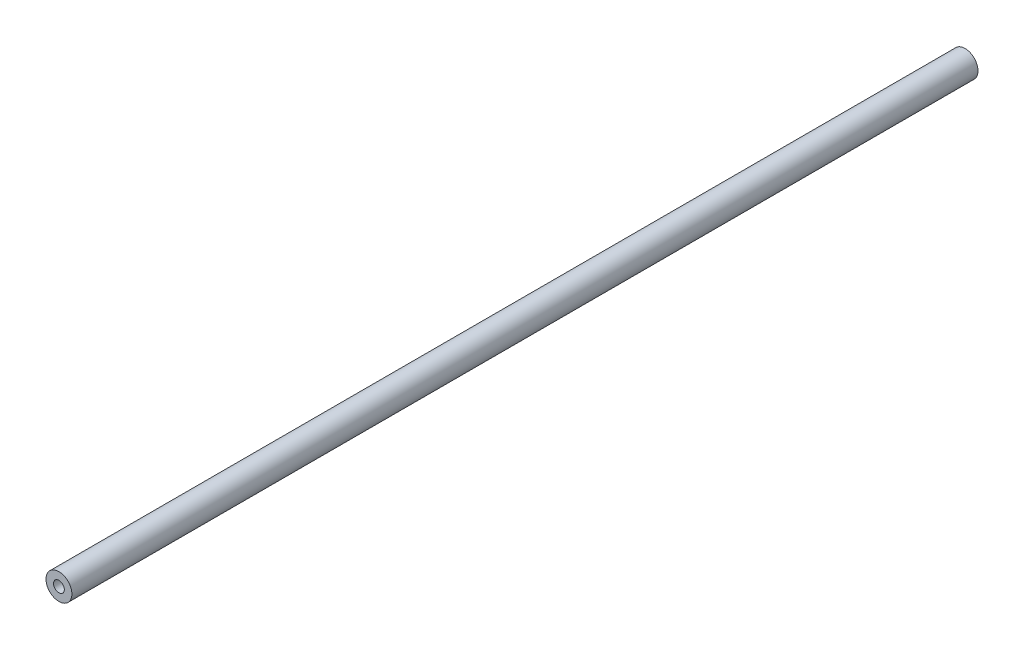
ISO-10303-21;
HEADER;
FILE_DESCRIPTION(('STEP AP214'),'2;1');
FILE_NAME('part.step','',(''),(''),'','','');
FILE_SCHEMA(('AUTOMOTIVE_DESIGN { 1 0 10303 214 1 1 1 1 }'));
ENDSEC;
DATA;
#1=APPLICATION_CONTEXT('core data for automotive mechanical design processes');
#2=APPLICATION_PROTOCOL_DEFINITION('international standard','automotive_design',2000,#1);
#3=PRODUCT_CONTEXT('',#1,'mechanical');
#4=PRODUCT('Part','Part','',(#3));
#5=PRODUCT_RELATED_PRODUCT_CATEGORY('part','',(#4));
#6=PRODUCT_DEFINITION_FORMATION('','',#4);
#7=PRODUCT_DEFINITION_CONTEXT('part definition',#1,'design');
#8=PRODUCT_DEFINITION('design','',#6,#7);
#9=PRODUCT_DEFINITION_SHAPE('','',#8);
#10=(LENGTH_UNIT() NAMED_UNIT(*) SI_UNIT(.MILLI.,.METRE.));
#11=(NAMED_UNIT(*) PLANE_ANGLE_UNIT() SI_UNIT($,.RADIAN.));
#12=(NAMED_UNIT(*) SI_UNIT($,.STERADIAN.) SOLID_ANGLE_UNIT());
#13=UNCERTAINTY_MEASURE_WITH_UNIT(LENGTH_MEASURE(1.E-05),#10,'distance_accuracy_value','');
#14=(GEOMETRIC_REPRESENTATION_CONTEXT(3) GLOBAL_UNCERTAINTY_ASSIGNED_CONTEXT((#13)) GLOBAL_UNIT_ASSIGNED_CONTEXT((#10,
#11,#12)) REPRESENTATION_CONTEXT('',''));
#15=CARTESIAN_POINT('',(0.,0.,0.));
#16=DIRECTION('',(0.,0.,1.));
#17=DIRECTION('',(1.,0.,0.));
#18=AXIS2_PLACEMENT_3D('',#15,#16,#17);
#19=CARTESIAN_POINT('',(0.,0.,-420.));
#20=DIRECTION('',(0.,0.,1.));
#21=DIRECTION('',(1.,0.,0.));
#22=AXIS2_PLACEMENT_3D('',#19,#20,#21);
#23=CYLINDRICAL_SURFACE('',#22,6.);
#24=CARTESIAN_POINT('',(0.,0.,-420.));
#25=DIRECTION('',(0.,0.,1.));
#26=DIRECTION('',(1.,0.,0.));
#27=AXIS2_PLACEMENT_3D('',#24,#25,#26);
#28=CIRCLE('',#27,6.);
#29=CARTESIAN_POINT('',(6.,0.,-420.));
#30=VERTEX_POINT('',#29);
#31=EDGE_CURVE('E10',#30,#30,#28,.T.);
#32=ORIENTED_EDGE('',*,*,#31,.T.);
#33=EDGE_LOOP('',(#32));
#34=FACE_BOUND('',#33,.T.);
#35=CARTESIAN_POINT('',(0.,0.,0.));
#36=DIRECTION('',(0.,0.,1.));
#37=DIRECTION('',(1.,0.,0.));
#38=AXIS2_PLACEMENT_3D('',#35,#36,#37);
#39=CIRCLE('',#38,6.);
#40=CARTESIAN_POINT('',(6.,0.,0.));
#41=VERTEX_POINT('',#40);
#42=EDGE_CURVE('E40',#41,#41,#39,.T.);
#43=ORIENTED_EDGE('',*,*,#42,.F.);
#44=EDGE_LOOP('',(#43));
#45=FACE_BOUND('',#44,.T.);
#46=ADVANCED_FACE('F37',(#34,#45),#23,.T.);
#47=CARTESIAN_POINT('',(0.,0.,-420.));
#48=DIRECTION('',(0.,0.,1.));
#49=DIRECTION('',(1.,0.,0.));
#50=AXIS2_PLACEMENT_3D('',#47,#48,#49);
#51=PLANE('',#50);
#52=CARTESIAN_POINT('',(0.,0.,-420.));
#53=DIRECTION('',(0.,0.,1.));
#54=DIRECTION('',(1.,0.,0.));
#55=AXIS2_PLACEMENT_3D('',#52,#53,#54);
#56=CIRCLE('',#55,2.5);
#57=CARTESIAN_POINT('',(2.5,0.,-420.));
#58=VERTEX_POINT('',#57);
#59=EDGE_CURVE('E49',#58,#58,#56,.T.);
#60=ORIENTED_EDGE('',*,*,#59,.T.);
#61=EDGE_LOOP('',(#60));
#62=FACE_BOUND('',#61,.T.);
#63=ORIENTED_EDGE('',*,*,#31,.F.);
#64=EDGE_LOOP('',(#63));
#65=FACE_BOUND('',#64,.T.);
#66=ADVANCED_FACE('F59',(#62,#65),#51,.F.);
#67=CARTESIAN_POINT('',(0.,0.,0.));
#68=DIRECTION('',(0.,0.,1.));
#69=DIRECTION('',(1.,0.,0.));
#70=AXIS2_PLACEMENT_3D('',#67,#68,#69);
#71=PLANE('',#70);
#72=CARTESIAN_POINT('',(0.,0.,0.));
#73=DIRECTION('',(0.,0.,1.));
#74=DIRECTION('',(1.,0.,0.));
#75=AXIS2_PLACEMENT_3D('',#72,#73,#74);
#76=CIRCLE('',#75,2.5);
#77=CARTESIAN_POINT('',(2.5,0.,0.));
#78=VERTEX_POINT('',#77);
#79=EDGE_CURVE('E51',#78,#78,#76,.T.);
#80=ORIENTED_EDGE('',*,*,#79,.F.);
#81=EDGE_LOOP('',(#80));
#82=FACE_BOUND('',#81,.T.);
#83=ORIENTED_EDGE('',*,*,#42,.T.);
#84=EDGE_LOOP('',(#83));
#85=FACE_BOUND('',#84,.T.);
#86=ADVANCED_FACE('F65',(#82,#85),#71,.T.);
#87=CARTESIAN_POINT('',(0.,0.,-420.));
#88=DIRECTION('',(0.,0.,1.));
#89=DIRECTION('',(1.,0.,0.));
#90=AXIS2_PLACEMENT_3D('',#87,#88,#89);
#91=CYLINDRICAL_SURFACE('',#90,2.5);
#92=ORIENTED_EDGE('',*,*,#59,.F.);
#93=EDGE_LOOP('',(#92));
#94=FACE_BOUND('',#93,.T.);
#95=ORIENTED_EDGE('',*,*,#79,.T.);
#96=EDGE_LOOP('',(#95));
#97=FACE_BOUND('',#96,.T.);
#98=ADVANCED_FACE('F62',(#94,#97),#91,.F.);
#99=CLOSED_SHELL('',(#46,#66,#86,#98));
#100=MANIFOLD_SOLID_BREP('B2',#99);
#101=ADVANCED_BREP_SHAPE_REPRESENTATION('',(#18,#100),#14);
#102=SHAPE_DEFINITION_REPRESENTATION(#9,#101);
ENDSEC;
END-ISO-10303-21;
